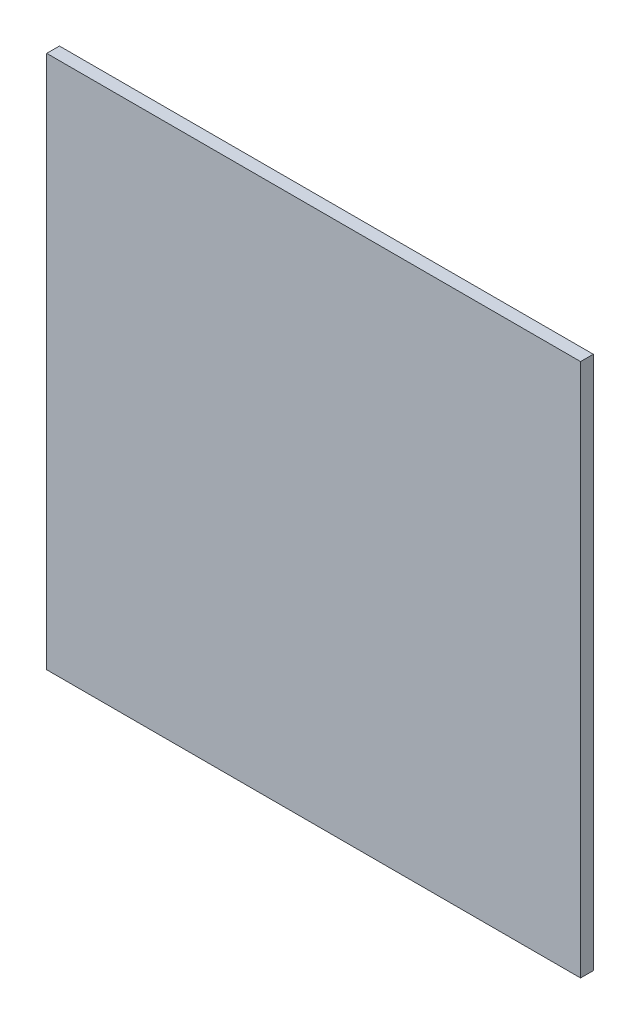
ISO-10303-21;
HEADER;
FILE_DESCRIPTION(('STEP AP214'),'2;1');
FILE_NAME('part.step','',(''),(''),'','','');
FILE_SCHEMA(('AUTOMOTIVE_DESIGN { 1 0 10303 214 1 1 1 1 }'));
ENDSEC;
DATA;
#1=APPLICATION_CONTEXT('core data for automotive mechanical design processes');
#2=APPLICATION_PROTOCOL_DEFINITION('international standard','automotive_design',2000,#1);
#3=PRODUCT_CONTEXT('',#1,'mechanical');
#4=PRODUCT('Part','Part','',(#3));
#5=PRODUCT_RELATED_PRODUCT_CATEGORY('part','',(#4));
#6=PRODUCT_DEFINITION_FORMATION('','',#4);
#7=PRODUCT_DEFINITION_CONTEXT('part definition',#1,'design');
#8=PRODUCT_DEFINITION('design','',#6,#7);
#9=PRODUCT_DEFINITION_SHAPE('','',#8);
#10=(LENGTH_UNIT() NAMED_UNIT(*) SI_UNIT(.MILLI.,.METRE.));
#11=(NAMED_UNIT(*) PLANE_ANGLE_UNIT() SI_UNIT($,.RADIAN.));
#12=(NAMED_UNIT(*) SI_UNIT($,.STERADIAN.) SOLID_ANGLE_UNIT());
#13=UNCERTAINTY_MEASURE_WITH_UNIT(LENGTH_MEASURE(1.E-05),#10,'distance_accuracy_value','');
#14=(GEOMETRIC_REPRESENTATION_CONTEXT(3) GLOBAL_UNCERTAINTY_ASSIGNED_CONTEXT((#13)) GLOBAL_UNIT_ASSIGNED_CONTEXT((#10,
#11,#12)) REPRESENTATION_CONTEXT('',''));
#15=CARTESIAN_POINT('',(0.,0.,0.));
#16=DIRECTION('',(0.,0.,1.));
#17=DIRECTION('',(1.,0.,0.));
#18=AXIS2_PLACEMENT_3D('',#15,#16,#17);
#19=CARTESIAN_POINT('',(-200.,4.7625,-4.7625));
#20=DIRECTION('',(0.,-1.,0.));
#21=DIRECTION('',(0.,0.,-1.));
#22=AXIS2_PLACEMENT_3D('',#19,#20,#21);
#23=PLANE('',#22);
#24=DIRECTION('',(1.,0.,0.));
#25=VECTOR('',#24,1.);
#26=CARTESIAN_POINT('',(-200.,4.7625,0.));
#27=LINE('',#26,#25);
#28=CARTESIAN_POINT('',(-200.,4.7625,0.));
#29=VERTEX_POINT('',#28);
#30=CARTESIAN_POINT('',(0.,4.7625,0.));
#31=VERTEX_POINT('',#30);
#32=EDGE_CURVE('E98',#29,#31,#27,.T.);
#33=ORIENTED_EDGE('',*,*,#32,.F.);
#34=DIRECTION('',(0.,0.,1.));
#35=VECTOR('',#34,1.);
#36=CARTESIAN_POINT('',(-200.,4.7625,-4.7625));
#37=LINE('',#36,#35);
#38=CARTESIAN_POINT('',(-200.,4.7625,-4.7625));
#39=VERTEX_POINT('',#38);
#40=EDGE_CURVE('E11',#39,#29,#37,.T.);
#41=ORIENTED_EDGE('',*,*,#40,.F.);
#42=DIRECTION('',(1.,0.,0.));
#43=VECTOR('',#42,1.);
#44=CARTESIAN_POINT('',(-200.,4.7625,-4.7625));
#45=LINE('',#44,#43);
#46=CARTESIAN_POINT('',(0.,4.7625,-4.7625));
#47=VERTEX_POINT('',#46);
#48=EDGE_CURVE('E93',#39,#47,#45,.T.);
#49=ORIENTED_EDGE('',*,*,#48,.T.);
#50=DIRECTION('',(0.,0.,1.));
#51=VECTOR('',#50,1.);
#52=CARTESIAN_POINT('',(0.,4.7625,-4.7625));
#53=LINE('',#52,#51);
#54=EDGE_CURVE('E36',#47,#31,#53,.T.);
#55=ORIENTED_EDGE('',*,*,#54,.T.);
#56=EDGE_LOOP('',(#33,#41,#49,#55));
#57=FACE_BOUND('',#56,.T.);
#58=ADVANCED_FACE('F33',(#57),#23,.T.);
#59=CARTESIAN_POINT('',(-200.,4.7625,-4.7625));
#60=DIRECTION('',(1.,0.,0.));
#61=DIRECTION('',(0.,0.,-1.));
#62=AXIS2_PLACEMENT_3D('',#59,#60,#61);
#63=PLANE('',#62);
#64=DIRECTION('',(0.,1.,0.));
#65=VECTOR('',#64,1.);
#66=CARTESIAN_POINT('',(-200.,4.7625,0.));
#67=LINE('',#66,#65);
#68=CARTESIAN_POINT('',(-200.,204.7625,0.));
#69=VERTEX_POINT('',#68);
#70=EDGE_CURVE('E66',#29,#69,#67,.T.);
#71=ORIENTED_EDGE('',*,*,#70,.T.);
#72=DIRECTION('',(0.,0.,1.));
#73=VECTOR('',#72,1.);
#74=CARTESIAN_POINT('',(-200.,204.7625,-4.7625));
#75=LINE('',#74,#73);
#76=CARTESIAN_POINT('',(-200.,204.7625,-4.7625));
#77=VERTEX_POINT('',#76);
#78=EDGE_CURVE('E42',#77,#69,#75,.T.);
#79=ORIENTED_EDGE('',*,*,#78,.F.);
#80=DIRECTION('',(0.,1.,0.));
#81=VECTOR('',#80,1.);
#82=CARTESIAN_POINT('',(-200.,4.7625,-4.7625));
#83=LINE('',#82,#81);
#84=EDGE_CURVE('E83',#39,#77,#83,.T.);
#85=ORIENTED_EDGE('',*,*,#84,.F.);
#86=ORIENTED_EDGE('',*,*,#40,.T.);
#87=EDGE_LOOP('',(#71,#79,#85,#86));
#88=FACE_BOUND('',#87,.T.);
#89=ADVANCED_FACE('F108',(#88),#63,.F.);
#90=CARTESIAN_POINT('',(-200.,204.7625,-4.7625));
#91=DIRECTION('',(0.,-1.,0.));
#92=DIRECTION('',(0.,0.,-1.));
#93=AXIS2_PLACEMENT_3D('',#90,#91,#92);
#94=PLANE('',#93);
#95=DIRECTION('',(1.,0.,0.));
#96=VECTOR('',#95,1.);
#97=CARTESIAN_POINT('',(-200.,204.7625,0.));
#98=LINE('',#97,#96);
#99=CARTESIAN_POINT('',(0.,204.7625,0.));
#100=VERTEX_POINT('',#99);
#101=EDGE_CURVE('E90',#69,#100,#98,.T.);
#102=ORIENTED_EDGE('',*,*,#101,.T.);
#103=DIRECTION('',(0.,0.,1.));
#104=VECTOR('',#103,1.);
#105=CARTESIAN_POINT('',(0.,204.7625,-4.7625));
#106=LINE('',#105,#104);
#107=CARTESIAN_POINT('',(0.,204.7625,-4.7625));
#108=VERTEX_POINT('',#107);
#109=EDGE_CURVE('E87',#108,#100,#106,.T.);
#110=ORIENTED_EDGE('',*,*,#109,.F.);
#111=DIRECTION('',(1.,0.,0.));
#112=VECTOR('',#111,1.);
#113=CARTESIAN_POINT('',(-200.,204.7625,-4.7625));
#114=LINE('',#113,#112);
#115=EDGE_CURVE('E78',#77,#108,#114,.T.);
#116=ORIENTED_EDGE('',*,*,#115,.F.);
#117=ORIENTED_EDGE('',*,*,#78,.T.);
#118=EDGE_LOOP('',(#102,#110,#116,#117));
#119=FACE_BOUND('',#118,.T.);
#120=ADVANCED_FACE('F88',(#119),#94,.F.);
#121=CARTESIAN_POINT('',(0.,4.7625,-4.7625));
#122=DIRECTION('',(1.,0.,0.));
#123=DIRECTION('',(0.,0.,-1.));
#124=AXIS2_PLACEMENT_3D('',#121,#122,#123);
#125=PLANE('',#124);
#126=DIRECTION('',(0.,1.,0.));
#127=VECTOR('',#126,1.);
#128=CARTESIAN_POINT('',(0.,4.7625,0.));
#129=LINE('',#128,#127);
#130=EDGE_CURVE('E101',#31,#100,#129,.T.);
#131=ORIENTED_EDGE('',*,*,#130,.F.);
#132=ORIENTED_EDGE('',*,*,#54,.F.);
#133=DIRECTION('',(0.,1.,0.));
#134=VECTOR('',#133,1.);
#135=CARTESIAN_POINT('',(0.,4.7625,-4.7625));
#136=LINE('',#135,#134);
#137=EDGE_CURVE('E82',#47,#108,#136,.T.);
#138=ORIENTED_EDGE('',*,*,#137,.T.);
#139=ORIENTED_EDGE('',*,*,#109,.T.);
#140=EDGE_LOOP('',(#131,#132,#138,#139));
#141=FACE_BOUND('',#140,.T.);
#142=ADVANCED_FACE('F92',(#141),#125,.T.);
#143=CARTESIAN_POINT('',(0.,0.,-4.7625));
#144=DIRECTION('',(0.,0.,1.));
#145=DIRECTION('',(1.,0.,0.));
#146=AXIS2_PLACEMENT_3D('',#143,#144,#145);
#147=PLANE('',#146);
#148=ORIENTED_EDGE('',*,*,#48,.F.);
#149=ORIENTED_EDGE('',*,*,#84,.T.);
#150=ORIENTED_EDGE('',*,*,#115,.T.);
#151=ORIENTED_EDGE('',*,*,#137,.F.);
#152=EDGE_LOOP('',(#148,#149,#150,#151));
#153=FACE_BOUND('',#152,.T.);
#154=ADVANCED_FACE('F81',(#153),#147,.F.);
#155=CARTESIAN_POINT('',(0.,0.,0.));
#156=DIRECTION('',(0.,0.,1.));
#157=DIRECTION('',(1.,0.,0.));
#158=AXIS2_PLACEMENT_3D('',#155,#156,#157);
#159=PLANE('',#158);
#160=ORIENTED_EDGE('',*,*,#32,.T.);
#161=ORIENTED_EDGE('',*,*,#130,.T.);
#162=ORIENTED_EDGE('',*,*,#101,.F.);
#163=ORIENTED_EDGE('',*,*,#70,.F.);
#164=EDGE_LOOP('',(#160,#161,#162,#163));
#165=FACE_BOUND('',#164,.T.);
#166=ADVANCED_FACE('F106',(#165),#159,.T.);
#167=CLOSED_SHELL('',(#58,#89,#120,#142,#154,#166));
#168=MANIFOLD_SOLID_BREP('B2',#167);
#169=ADVANCED_BREP_SHAPE_REPRESENTATION('',(#18,#168),#14);
#170=SHAPE_DEFINITION_REPRESENTATION(#9,#169);
ENDSEC;
END-ISO-10303-21;
